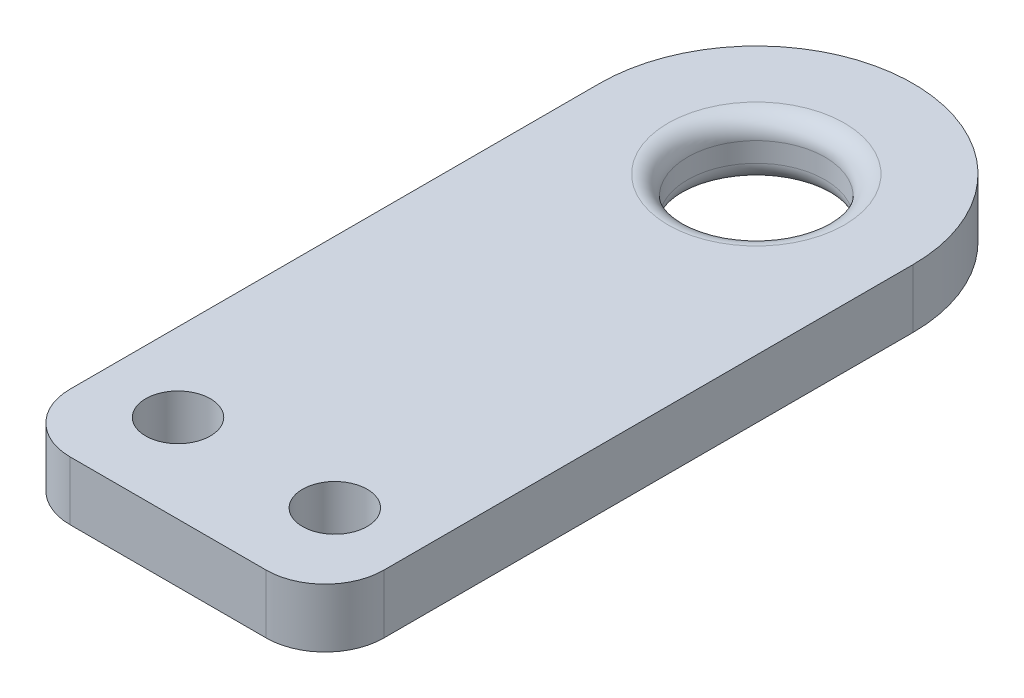
ISO-10303-21;
HEADER;
FILE_DESCRIPTION(('STEP AP214'),'2;1');
FILE_NAME('part.step','',(''),(''),'','','');
FILE_SCHEMA(('AUTOMOTIVE_DESIGN { 1 0 10303 214 1 1 1 1 }'));
ENDSEC;
DATA;
#1=APPLICATION_CONTEXT('core data for automotive mechanical design processes');
#2=APPLICATION_PROTOCOL_DEFINITION('international standard','automotive_design',2000,#1);
#3=PRODUCT_CONTEXT('',#1,'mechanical');
#4=PRODUCT('Part','Part','',(#3));
#5=PRODUCT_RELATED_PRODUCT_CATEGORY('part','',(#4));
#6=PRODUCT_DEFINITION_FORMATION('','',#4);
#7=PRODUCT_DEFINITION_CONTEXT('part definition',#1,'design');
#8=PRODUCT_DEFINITION('design','',#6,#7);
#9=PRODUCT_DEFINITION_SHAPE('','',#8);
#10=(LENGTH_UNIT() NAMED_UNIT(*) SI_UNIT(.MILLI.,.METRE.));
#11=(NAMED_UNIT(*) PLANE_ANGLE_UNIT() SI_UNIT($,.RADIAN.));
#12=(NAMED_UNIT(*) SI_UNIT($,.STERADIAN.) SOLID_ANGLE_UNIT());
#13=UNCERTAINTY_MEASURE_WITH_UNIT(LENGTH_MEASURE(1.E-05),#10,'distance_accuracy_value','');
#14=(GEOMETRIC_REPRESENTATION_CONTEXT(3) GLOBAL_UNCERTAINTY_ASSIGNED_CONTEXT((#13)) GLOBAL_UNIT_ASSIGNED_CONTEXT((#10,
#11,#12)) REPRESENTATION_CONTEXT('',''));
#15=CARTESIAN_POINT('',(0.,0.,0.));
#16=DIRECTION('',(0.,0.,1.));
#17=DIRECTION('',(1.,0.,0.));
#18=AXIS2_PLACEMENT_3D('',#15,#16,#17);
#19=CARTESIAN_POINT('',(0.,1.5,0.));
#20=DIRECTION('',(0.,-1.,0.));
#21=DIRECTION('',(0.,0.,-1.));
#22=AXIS2_PLACEMENT_3D('',#19,#20,#21);
#23=CYLINDRICAL_SURFACE('',#22,8.);
#24=DIRECTION('',(0.,-1.,0.));
#25=VECTOR('',#24,1.);
#26=CARTESIAN_POINT('',(-8.,1.5,0.));
#27=LINE('',#26,#25);
#28=CARTESIAN_POINT('',(-8.,1.5,0.));
#29=VERTEX_POINT('',#28);
#30=CARTESIAN_POINT('',(-8.,-1.5,0.));
#31=VERTEX_POINT('',#30);
#32=EDGE_CURVE('E118',#29,#31,#27,.T.);
#33=ORIENTED_EDGE('',*,*,#32,.F.);
#34=CARTESIAN_POINT('',(0.,1.5,0.));
#35=DIRECTION('',(0.,1.,0.));
#36=DIRECTION('',(0.,0.,1.));
#37=AXIS2_PLACEMENT_3D('',#34,#35,#36);
#38=CIRCLE('',#37,8.);
#39=CARTESIAN_POINT('',(8.,1.5,0.));
#40=VERTEX_POINT('',#39);
#41=EDGE_CURVE('E114',#40,#29,#38,.T.);
#42=ORIENTED_EDGE('',*,*,#41,.F.);
#43=DIRECTION('',(0.,-1.,0.));
#44=VECTOR('',#43,1.);
#45=CARTESIAN_POINT('',(8.,1.5,0.));
#46=LINE('',#45,#44);
#47=CARTESIAN_POINT('',(8.,-1.5,0.));
#48=VERTEX_POINT('',#47);
#49=EDGE_CURVE('E101',#40,#48,#46,.T.);
#50=ORIENTED_EDGE('',*,*,#49,.T.);
#51=CARTESIAN_POINT('',(0.,-1.5,0.));
#52=DIRECTION('',(0.,1.,0.));
#53=DIRECTION('',(0.,0.,1.));
#54=AXIS2_PLACEMENT_3D('',#51,#52,#53);
#55=CIRCLE('',#54,8.);
#56=EDGE_CURVE('E108',#48,#31,#55,.T.);
#57=ORIENTED_EDGE('',*,*,#56,.T.);
#58=EDGE_LOOP('',(#33,#42,#50,#57));
#59=FACE_BOUND('',#58,.T.);
#60=ADVANCED_FACE('F41',(#59),#23,.T.);
#61=CARTESIAN_POINT('',(0.,1.5,0.));
#62=DIRECTION('',(0.,1.,0.));
#63=DIRECTION('',(0.,0.,1.));
#64=AXIS2_PLACEMENT_3D('',#61,#62,#63);
#65=PLANE('',#64);
#66=CARTESIAN_POINT('',(0.,1.5,0.));
#67=DIRECTION('',(0.,1.,0.));
#68=DIRECTION('',(0.,0.,1.));
#69=AXIS2_PLACEMENT_3D('',#66,#67,#68);
#70=CIRCLE('',#69,4.5);
#71=CARTESIAN_POINT('',(0.,1.5,4.5));
#72=VERTEX_POINT('',#71);
#73=EDGE_CURVE('E124',#72,#72,#70,.F.);
#74=ORIENTED_EDGE('',*,*,#73,.T.);
#75=EDGE_LOOP('',(#74));
#76=FACE_BOUND('',#75,.T.);
#77=CARTESIAN_POINT('',(4.,1.5,25.5));
#78=DIRECTION('',(0.,1.,0.));
#79=DIRECTION('',(0.,0.,1.));
#80=AXIS2_PLACEMENT_3D('',#77,#78,#79);
#81=CIRCLE('',#80,1.65);
#82=CARTESIAN_POINT('',(4.,1.5,27.15));
#83=VERTEX_POINT('',#82);
#84=EDGE_CURVE('E163',#83,#83,#81,.T.);
#85=ORIENTED_EDGE('',*,*,#84,.F.);
#86=EDGE_LOOP('',(#85));
#87=FACE_BOUND('',#86,.T.);
#88=CARTESIAN_POINT('',(-4.,1.5,25.5));
#89=DIRECTION('',(0.,1.,0.));
#90=DIRECTION('',(0.,0.,1.));
#91=AXIS2_PLACEMENT_3D('',#88,#89,#90);
#92=CIRCLE('',#91,1.65);
#93=CARTESIAN_POINT('',(-4.,1.5,27.15));
#94=VERTEX_POINT('',#93);
#95=EDGE_CURVE('E168',#94,#94,#92,.T.);
#96=ORIENTED_EDGE('',*,*,#95,.F.);
#97=EDGE_LOOP('',(#96));
#98=FACE_BOUND('',#97,.T.);
#99=DIRECTION('',(0.,0.,1.));
#100=VECTOR('',#99,1.);
#101=CARTESIAN_POINT('',(-8.,1.5,0.));
#102=LINE('',#101,#100);
#103=CARTESIAN_POINT('',(-8.,1.5,27.));
#104=VERTEX_POINT('',#103);
#105=EDGE_CURVE('E104',#29,#104,#102,.T.);
#106=ORIENTED_EDGE('',*,*,#105,.T.);
#107=CARTESIAN_POINT('',(-5.,1.5,27.));
#108=DIRECTION('',(0.,1.,0.));
#109=DIRECTION('',(0.,0.,1.));
#110=AXIS2_PLACEMENT_3D('',#107,#108,#109);
#111=CIRCLE('',#110,3.);
#112=CARTESIAN_POINT('',(-5.,1.5,30.));
#113=VERTEX_POINT('',#112);
#114=EDGE_CURVE('E49',#104,#113,#111,.T.);
#115=ORIENTED_EDGE('',*,*,#114,.T.);
#116=DIRECTION('',(1.,0.,0.));
#117=VECTOR('',#116,1.);
#118=CARTESIAN_POINT('',(-8.,1.5,30.));
#119=LINE('',#118,#117);
#120=CARTESIAN_POINT('',(5.,1.5,30.));
#121=VERTEX_POINT('',#120);
#122=EDGE_CURVE('E149',#113,#121,#119,.T.);
#123=ORIENTED_EDGE('',*,*,#122,.T.);
#124=CARTESIAN_POINT('',(5.,1.5,27.));
#125=DIRECTION('',(0.,1.,0.));
#126=DIRECTION('',(0.,0.,1.));
#127=AXIS2_PLACEMENT_3D('',#124,#125,#126);
#128=CIRCLE('',#127,3.);
#129=CARTESIAN_POINT('',(8.,1.5,27.));
#130=VERTEX_POINT('',#129);
#131=EDGE_CURVE('E56',#121,#130,#128,.T.);
#132=ORIENTED_EDGE('',*,*,#131,.T.);
#133=DIRECTION('',(0.,0.,-1.));
#134=VECTOR('',#133,1.);
#135=CARTESIAN_POINT('',(8.,1.5,0.));
#136=LINE('',#135,#134);
#137=EDGE_CURVE('E120',#130,#40,#136,.T.);
#138=ORIENTED_EDGE('',*,*,#137,.T.);
#139=ORIENTED_EDGE('',*,*,#41,.T.);
#140=EDGE_LOOP('',(#106,#115,#123,#132,#138,#139));
#141=FACE_BOUND('',#140,.T.);
#142=ADVANCED_FACE('F148',(#76,#87,#98,#141),#65,.T.);
#143=CARTESIAN_POINT('',(0.,-1.5,0.));
#144=DIRECTION('',(0.,1.,0.));
#145=DIRECTION('',(0.,0.,1.));
#146=AXIS2_PLACEMENT_3D('',#143,#144,#145);
#147=PLANE('',#146);
#148=CARTESIAN_POINT('',(0.,-1.5,0.));
#149=DIRECTION('',(0.,1.,0.));
#150=DIRECTION('',(0.,0.,1.));
#151=AXIS2_PLACEMENT_3D('',#148,#149,#150);
#152=CIRCLE('',#151,4.5);
#153=CARTESIAN_POINT('',(0.,-1.5,4.5));
#154=VERTEX_POINT('',#153);
#155=EDGE_CURVE('E133',#154,#154,#152,.T.);
#156=ORIENTED_EDGE('',*,*,#155,.T.);
#157=EDGE_LOOP('',(#156));
#158=FACE_BOUND('',#157,.T.);
#159=CARTESIAN_POINT('',(4.,-1.5,25.5));
#160=DIRECTION('',(0.,1.,0.));
#161=DIRECTION('',(0.,0.,1.));
#162=AXIS2_PLACEMENT_3D('',#159,#160,#161);
#163=CIRCLE('',#162,1.65);
#164=CARTESIAN_POINT('',(4.,-1.5,27.15));
#165=VERTEX_POINT('',#164);
#166=EDGE_CURVE('E159',#165,#165,#163,.F.);
#167=ORIENTED_EDGE('',*,*,#166,.F.);
#168=EDGE_LOOP('',(#167));
#169=FACE_BOUND('',#168,.T.);
#170=CARTESIAN_POINT('',(-4.,-1.5,25.5));
#171=DIRECTION('',(0.,1.,0.));
#172=DIRECTION('',(0.,0.,1.));
#173=AXIS2_PLACEMENT_3D('',#170,#171,#172);
#174=CIRCLE('',#173,1.65);
#175=CARTESIAN_POINT('',(-4.,-1.5,27.15));
#176=VERTEX_POINT('',#175);
#177=EDGE_CURVE('E171',#176,#176,#174,.F.);
#178=ORIENTED_EDGE('',*,*,#177,.F.);
#179=EDGE_LOOP('',(#178));
#180=FACE_BOUND('',#179,.T.);
#181=DIRECTION('',(1.,0.,0.));
#182=VECTOR('',#181,1.);
#183=CARTESIAN_POINT('',(-8.,-1.5,30.));
#184=LINE('',#183,#182);
#185=CARTESIAN_POINT('',(-5.,-1.5,30.));
#186=VERTEX_POINT('',#185);
#187=CARTESIAN_POINT('',(5.,-1.5,30.));
#188=VERTEX_POINT('',#187);
#189=EDGE_CURVE('E105',#186,#188,#184,.T.);
#190=ORIENTED_EDGE('',*,*,#189,.F.);
#191=CARTESIAN_POINT('',(-5.,-1.5,27.));
#192=DIRECTION('',(0.,1.,0.));
#193=DIRECTION('',(0.,0.,1.));
#194=AXIS2_PLACEMENT_3D('',#191,#192,#193);
#195=CIRCLE('',#194,3.);
#196=CARTESIAN_POINT('',(-8.,-1.5,27.));
#197=VERTEX_POINT('',#196);
#198=EDGE_CURVE('E143',#186,#197,#195,.F.);
#199=ORIENTED_EDGE('',*,*,#198,.T.);
#200=DIRECTION('',(0.,0.,1.));
#201=VECTOR('',#200,1.);
#202=CARTESIAN_POINT('',(-8.,-1.5,0.));
#203=LINE('',#202,#201);
#204=EDGE_CURVE('E111',#31,#197,#203,.T.);
#205=ORIENTED_EDGE('',*,*,#204,.F.);
#206=ORIENTED_EDGE('',*,*,#56,.F.);
#207=DIRECTION('',(0.,0.,-1.));
#208=VECTOR('',#207,1.);
#209=CARTESIAN_POINT('',(8.,-1.5,0.));
#210=LINE('',#209,#208);
#211=CARTESIAN_POINT('',(8.,-1.5,27.));
#212=VERTEX_POINT('',#211);
#213=EDGE_CURVE('E97',#212,#48,#210,.T.);
#214=ORIENTED_EDGE('',*,*,#213,.F.);
#215=CARTESIAN_POINT('',(5.,-1.5,27.));
#216=DIRECTION('',(0.,1.,0.));
#217=DIRECTION('',(0.,0.,1.));
#218=AXIS2_PLACEMENT_3D('',#215,#216,#217);
#219=CIRCLE('',#218,3.);
#220=EDGE_CURVE('E141',#212,#188,#219,.F.);
#221=ORIENTED_EDGE('',*,*,#220,.T.);
#222=EDGE_LOOP('',(#190,#199,#205,#206,#214,#221));
#223=FACE_BOUND('',#222,.T.);
#224=ADVANCED_FACE('F110',(#158,#169,#180,#223),#147,.F.);
#225=CARTESIAN_POINT('',(-8.,1.5,0.));
#226=DIRECTION('',(1.,0.,0.));
#227=DIRECTION('',(0.,0.,-1.));
#228=AXIS2_PLACEMENT_3D('',#225,#226,#227);
#229=PLANE('',#228);
#230=ORIENTED_EDGE('',*,*,#204,.T.);
#231=DIRECTION('',(0.,-1.,0.));
#232=VECTOR('',#231,1.);
#233=CARTESIAN_POINT('',(-8.,1.5,27.));
#234=LINE('',#233,#232);
#235=EDGE_CURVE('E64',#197,#104,#234,.F.);
#236=ORIENTED_EDGE('',*,*,#235,.T.);
#237=ORIENTED_EDGE('',*,*,#105,.F.);
#238=ORIENTED_EDGE('',*,*,#32,.T.);
#239=EDGE_LOOP('',(#230,#236,#237,#238));
#240=FACE_BOUND('',#239,.T.);
#241=ADVANCED_FACE('F158',(#240),#229,.F.);
#242=CARTESIAN_POINT('',(-8.,1.5,30.));
#243=DIRECTION('',(0.,0.,-1.));
#244=DIRECTION('',(-1.,0.,0.));
#245=AXIS2_PLACEMENT_3D('',#242,#243,#244);
#246=PLANE('',#245);
#247=ORIENTED_EDGE('',*,*,#122,.F.);
#248=DIRECTION('',(0.,-1.,0.));
#249=VECTOR('',#248,1.);
#250=CARTESIAN_POINT('',(-5.,1.5,30.));
#251=LINE('',#250,#249);
#252=EDGE_CURVE('E138',#113,#186,#251,.T.);
#253=ORIENTED_EDGE('',*,*,#252,.T.);
#254=ORIENTED_EDGE('',*,*,#189,.T.);
#255=DIRECTION('',(0.,-1.,0.));
#256=VECTOR('',#255,1.);
#257=CARTESIAN_POINT('',(5.,1.5,30.));
#258=LINE('',#257,#256);
#259=EDGE_CURVE('E136',#188,#121,#258,.F.);
#260=ORIENTED_EDGE('',*,*,#259,.T.);
#261=EDGE_LOOP('',(#247,#253,#254,#260));
#262=FACE_BOUND('',#261,.T.);
#263=ADVANCED_FACE('F153',(#262),#246,.F.);
#264=CARTESIAN_POINT('',(8.,1.5,0.));
#265=DIRECTION('',(-1.,0.,0.));
#266=DIRECTION('',(0.,0.,1.));
#267=AXIS2_PLACEMENT_3D('',#264,#265,#266);
#268=PLANE('',#267);
#269=ORIENTED_EDGE('',*,*,#137,.F.);
#270=DIRECTION('',(0.,-1.,0.));
#271=VECTOR('',#270,1.);
#272=CARTESIAN_POINT('',(8.,1.5,27.));
#273=LINE('',#272,#271);
#274=EDGE_CURVE('E11',#130,#212,#273,.T.);
#275=ORIENTED_EDGE('',*,*,#274,.T.);
#276=ORIENTED_EDGE('',*,*,#213,.T.);
#277=ORIENTED_EDGE('',*,*,#49,.F.);
#278=EDGE_LOOP('',(#269,#275,#276,#277));
#279=FACE_BOUND('',#278,.T.);
#280=ADVANCED_FACE('F99',(#279),#268,.F.);
#281=CARTESIAN_POINT('',(-4.,-1.501,25.5));
#282=DIRECTION('',(0.,1.,0.));
#283=DIRECTION('',(0.,0.,1.));
#284=AXIS2_PLACEMENT_3D('',#281,#282,#283);
#285=CYLINDRICAL_SURFACE('',#284,1.65);
#286=CARTESIAN_POINT('',(-4.,1.5,27.15));
#287=CARTESIAN_POINT('',(-4.,1.46875,27.15));
#288=CARTESIAN_POINT('',(-4.,1.4375,27.15));
#289=CARTESIAN_POINT('',(-4.,1.375,27.15));
#290=CARTESIAN_POINT('',(-4.,1.34375,27.15));
#291=CARTESIAN_POINT('',(-4.,1.28125,27.15));
#292=CARTESIAN_POINT('',(-4.,1.25,27.15));
#293=CARTESIAN_POINT('',(-4.,1.1875,27.15));
#294=CARTESIAN_POINT('',(-4.,1.15625,27.15));
#295=CARTESIAN_POINT('',(-4.,1.09375,27.15));
#296=CARTESIAN_POINT('',(-4.,1.0625,27.15));
#297=CARTESIAN_POINT('',(-4.,1.,27.15));
#298=CARTESIAN_POINT('',(-4.,0.96875,27.15));
#299=CARTESIAN_POINT('',(-4.,0.90625,27.15));
#300=CARTESIAN_POINT('',(-4.,0.874999999999999,27.15));
#301=CARTESIAN_POINT('',(-4.,0.8125,27.15));
#302=CARTESIAN_POINT('',(-4.,0.78125,27.15));
#303=CARTESIAN_POINT('',(-4.,0.71875,27.15));
#304=CARTESIAN_POINT('',(-4.,0.6875,27.15));
#305=CARTESIAN_POINT('',(-4.,0.625,27.15));
#306=CARTESIAN_POINT('',(-4.,0.59375,27.15));
#307=CARTESIAN_POINT('',(-4.,0.53125,27.15));
#308=CARTESIAN_POINT('',(-4.,0.5,27.15));
#309=CARTESIAN_POINT('',(-4.,0.4375,27.15));
#310=CARTESIAN_POINT('',(-4.,0.40625,27.15));
#311=CARTESIAN_POINT('',(-4.,0.34375,27.15));
#312=CARTESIAN_POINT('',(-4.,0.3125,27.15));
#313=CARTESIAN_POINT('',(-4.,0.25,27.15));
#314=CARTESIAN_POINT('',(-4.,0.21875,27.15));
#315=CARTESIAN_POINT('',(-4.,0.15625,27.15));
#316=CARTESIAN_POINT('',(-4.,0.125,27.15));
#317=CARTESIAN_POINT('',(-4.,0.0624999999999998,27.15));
#318=CARTESIAN_POINT('',(-4.,0.0312499999999998,27.15));
#319=CARTESIAN_POINT('',(-4.,-0.0312500000000002,27.15));
#320=CARTESIAN_POINT('',(-4.,-0.0625000000000003,27.15));
#321=CARTESIAN_POINT('',(-4.,-0.125,27.15));
#322=CARTESIAN_POINT('',(-4.,-0.15625,27.15));
#323=CARTESIAN_POINT('',(-4.,-0.21875,27.15));
#324=CARTESIAN_POINT('',(-4.,-0.25,27.15));
#325=CARTESIAN_POINT('',(-4.,-0.3125,27.15));
#326=CARTESIAN_POINT('',(-4.,-0.34375,27.15));
#327=CARTESIAN_POINT('',(-4.,-0.40625,27.15));
#328=CARTESIAN_POINT('',(-4.,-0.4375,27.15));
#329=CARTESIAN_POINT('',(-4.,-0.5,27.15));
#330=CARTESIAN_POINT('',(-4.,-0.53125,27.15));
#331=CARTESIAN_POINT('',(-4.,-0.59375,27.15));
#332=CARTESIAN_POINT('',(-4.,-0.625,27.15));
#333=CARTESIAN_POINT('',(-4.,-0.6875,27.15));
#334=CARTESIAN_POINT('',(-4.,-0.71875,27.15));
#335=CARTESIAN_POINT('',(-4.,-0.78125,27.15));
#336=CARTESIAN_POINT('',(-4.,-0.8125,27.15));
#337=CARTESIAN_POINT('',(-4.,-0.875,27.15));
#338=CARTESIAN_POINT('',(-4.,-0.90625,27.15));
#339=CARTESIAN_POINT('',(-4.,-0.96875,27.15));
#340=CARTESIAN_POINT('',(-4.,-1.,27.15));
#341=CARTESIAN_POINT('',(-4.,-1.0625,27.15));
#342=CARTESIAN_POINT('',(-4.,-1.09375,27.15));
#343=CARTESIAN_POINT('',(-4.,-1.15625,27.15));
#344=CARTESIAN_POINT('',(-4.,-1.1875,27.15));
#345=CARTESIAN_POINT('',(-4.,-1.25,27.15));
#346=CARTESIAN_POINT('',(-4.,-1.28125,27.15));
#347=CARTESIAN_POINT('',(-4.,-1.34375,27.15));
#348=CARTESIAN_POINT('',(-4.,-1.375,27.15));
#349=CARTESIAN_POINT('',(-4.,-1.4375,27.15));
#350=CARTESIAN_POINT('',(-4.,-1.46875,27.15));
#351=CARTESIAN_POINT('',(-4.,-1.5,27.15));
#352=B_SPLINE_CURVE_WITH_KNOTS('',3,(#286,#287,#288,#289,#290,#291,#292,#293,#294,#295,#296,
#297,#298,#299,#300,#301,#302,#303,#304,#305,#306,#307,#308,#309,#310,#311,#312,#313,#314,#315,
#316,#317,#318,#319,#320,#321,#322,#323,#324,#325,#326,#327,#328,#329,#330,#331,#332,#333,#334,
#335,#336,#337,#338,#339,#340,#341,#342,#343,#344,#345,#346,#347,#348,#349,#350,#351),
.UNSPECIFIED.,.F.,.F.,(4,2,2,2,2,2,2,2,2,2,2,2,2,2,2,2,2,2,2,2,2,2,2,2,2,2,2,2,2,2,2,2,4),(0.,
0.0937500000000001,0.1875,0.28125,0.375,0.46875,0.5625,0.65625,0.75,0.84375,0.9375,1.03125,
1.125,1.21875,1.3125,1.40625,1.5,1.59375,1.6875,1.78125,1.875,1.96875,2.0625,2.15625,2.25,
2.34375,2.4375,2.53125,2.625,2.71875,2.8125,2.90625,3.),.UNSPECIFIED.);
#353=EDGE_CURVE('BSEAM186',#94,#176,#352,.T.);
#354=ORIENTED_EDGE('',*,*,#95,.T.);
#355=ORIENTED_EDGE('',*,*,#177,.T.);
#356=ORIENTED_EDGE('',*,*,#353,.T.);
#357=ORIENTED_EDGE('',*,*,#353,.F.);
#358=EDGE_LOOP('',(#354,#356,#355,#357));
#359=FACE_BOUND('',#358,.T.);
#360=ADVANCED_FACE('F186',(#359),#285,.F.);
#361=CARTESIAN_POINT('',(4.,-1.501,25.5));
#362=DIRECTION('',(0.,1.,0.));
#363=DIRECTION('',(0.,0.,1.));
#364=AXIS2_PLACEMENT_3D('',#361,#362,#363);
#365=CYLINDRICAL_SURFACE('',#364,1.65);
#366=CARTESIAN_POINT('',(4.,1.5,27.15));
#367=CARTESIAN_POINT('',(4.,1.46875,27.15));
#368=CARTESIAN_POINT('',(4.,1.4375,27.15));
#369=CARTESIAN_POINT('',(4.,1.375,27.15));
#370=CARTESIAN_POINT('',(4.,1.34375,27.15));
#371=CARTESIAN_POINT('',(4.,1.28125,27.15));
#372=CARTESIAN_POINT('',(4.,1.25,27.15));
#373=CARTESIAN_POINT('',(4.,1.1875,27.15));
#374=CARTESIAN_POINT('',(4.,1.15625,27.15));
#375=CARTESIAN_POINT('',(4.,1.09375,27.15));
#376=CARTESIAN_POINT('',(4.,1.0625,27.15));
#377=CARTESIAN_POINT('',(4.,1.,27.15));
#378=CARTESIAN_POINT('',(4.,0.96875,27.15));
#379=CARTESIAN_POINT('',(4.,0.90625,27.15));
#380=CARTESIAN_POINT('',(4.,0.874999999999999,27.15));
#381=CARTESIAN_POINT('',(4.,0.8125,27.15));
#382=CARTESIAN_POINT('',(4.,0.78125,27.15));
#383=CARTESIAN_POINT('',(4.,0.71875,27.15));
#384=CARTESIAN_POINT('',(4.,0.6875,27.15));
#385=CARTESIAN_POINT('',(4.,0.625,27.15));
#386=CARTESIAN_POINT('',(4.,0.59375,27.15));
#387=CARTESIAN_POINT('',(4.,0.53125,27.15));
#388=CARTESIAN_POINT('',(4.,0.5,27.15));
#389=CARTESIAN_POINT('',(4.,0.4375,27.15));
#390=CARTESIAN_POINT('',(4.,0.40625,27.15));
#391=CARTESIAN_POINT('',(4.,0.34375,27.15));
#392=CARTESIAN_POINT('',(4.,0.3125,27.15));
#393=CARTESIAN_POINT('',(4.,0.25,27.15));
#394=CARTESIAN_POINT('',(4.,0.21875,27.15));
#395=CARTESIAN_POINT('',(4.,0.15625,27.15));
#396=CARTESIAN_POINT('',(4.,0.125,27.15));
#397=CARTESIAN_POINT('',(4.,0.0624999999999998,27.15));
#398=CARTESIAN_POINT('',(4.,0.0312499999999998,27.15));
#399=CARTESIAN_POINT('',(4.,-0.0312500000000002,27.15));
#400=CARTESIAN_POINT('',(4.,-0.0625000000000003,27.15));
#401=CARTESIAN_POINT('',(4.,-0.125,27.15));
#402=CARTESIAN_POINT('',(4.,-0.15625,27.15));
#403=CARTESIAN_POINT('',(4.,-0.21875,27.15));
#404=CARTESIAN_POINT('',(4.,-0.25,27.15));
#405=CARTESIAN_POINT('',(4.,-0.3125,27.15));
#406=CARTESIAN_POINT('',(4.,-0.34375,27.15));
#407=CARTESIAN_POINT('',(4.,-0.40625,27.15));
#408=CARTESIAN_POINT('',(4.,-0.4375,27.15));
#409=CARTESIAN_POINT('',(4.,-0.5,27.15));
#410=CARTESIAN_POINT('',(4.,-0.53125,27.15));
#411=CARTESIAN_POINT('',(4.,-0.59375,27.15));
#412=CARTESIAN_POINT('',(4.,-0.625,27.15));
#413=CARTESIAN_POINT('',(4.,-0.6875,27.15));
#414=CARTESIAN_POINT('',(4.,-0.71875,27.15));
#415=CARTESIAN_POINT('',(4.,-0.78125,27.15));
#416=CARTESIAN_POINT('',(4.,-0.8125,27.15));
#417=CARTESIAN_POINT('',(4.,-0.875,27.15));
#418=CARTESIAN_POINT('',(4.,-0.90625,27.15));
#419=CARTESIAN_POINT('',(4.,-0.96875,27.15));
#420=CARTESIAN_POINT('',(4.,-1.,27.15));
#421=CARTESIAN_POINT('',(4.,-1.0625,27.15));
#422=CARTESIAN_POINT('',(4.,-1.09375,27.15));
#423=CARTESIAN_POINT('',(4.,-1.15625,27.15));
#424=CARTESIAN_POINT('',(4.,-1.1875,27.15));
#425=CARTESIAN_POINT('',(4.,-1.25,27.15));
#426=CARTESIAN_POINT('',(4.,-1.28125,27.15));
#427=CARTESIAN_POINT('',(4.,-1.34375,27.15));
#428=CARTESIAN_POINT('',(4.,-1.375,27.15));
#429=CARTESIAN_POINT('',(4.,-1.4375,27.15));
#430=CARTESIAN_POINT('',(4.,-1.46875,27.15));
#431=CARTESIAN_POINT('',(4.,-1.5,27.15));
#432=B_SPLINE_CURVE_WITH_KNOTS('',3,(#366,#367,#368,#369,#370,#371,#372,#373,#374,#375,#376,
#377,#378,#379,#380,#381,#382,#383,#384,#385,#386,#387,#388,#389,#390,#391,#392,#393,#394,#395,
#396,#397,#398,#399,#400,#401,#402,#403,#404,#405,#406,#407,#408,#409,#410,#411,#412,#413,#414,
#415,#416,#417,#418,#419,#420,#421,#422,#423,#424,#425,#426,#427,#428,#429,#430,#431),
.UNSPECIFIED.,.F.,.F.,(4,2,2,2,2,2,2,2,2,2,2,2,2,2,2,2,2,2,2,2,2,2,2,2,2,2,2,2,2,2,2,2,4),(0.,
0.0937500000000001,0.1875,0.28125,0.375,0.46875,0.5625,0.65625,0.75,0.84375,0.9375,1.03125,
1.125,1.21875,1.3125,1.40625,1.5,1.59375,1.6875,1.78125,1.875,1.96875,2.0625,2.15625,2.25,
2.34375,2.4375,2.53125,2.625,2.71875,2.8125,2.90625,3.),.UNSPECIFIED.);
#433=EDGE_CURVE('BSEAM177',#83,#165,#432,.T.);
#434=ORIENTED_EDGE('',*,*,#84,.T.);
#435=ORIENTED_EDGE('',*,*,#166,.T.);
#436=ORIENTED_EDGE('',*,*,#433,.T.);
#437=ORIENTED_EDGE('',*,*,#433,.F.);
#438=EDGE_LOOP('',(#434,#436,#435,#437));
#439=FACE_BOUND('',#438,.T.);
#440=ADVANCED_FACE('F177',(#439),#365,.F.);
#441=CARTESIAN_POINT('',(0.,1.501,0.));
#442=DIRECTION('',(0.,-1.,0.));
#443=DIRECTION('',(0.,0.,-1.));
#444=AXIS2_PLACEMENT_3D('',#441,#442,#443);
#445=CYLINDRICAL_SURFACE('',#444,3.5);
#446=CARTESIAN_POINT('',(0.,0.5,0.));
#447=DIRECTION('',(0.,1.,0.));
#448=DIRECTION('',(0.,0.,1.));
#449=AXIS2_PLACEMENT_3D('',#446,#447,#448);
#450=CIRCLE('',#449,3.5);
#451=CARTESIAN_POINT('',(0.,0.5,-3.5));
#452=VERTEX_POINT('',#451);
#453=EDGE_CURVE('E130',#452,#452,#450,.T.);
#454=CARTESIAN_POINT('',(0.,-0.5,0.));
#455=DIRECTION('',(0.,1.,0.));
#456=DIRECTION('',(0.,0.,1.));
#457=AXIS2_PLACEMENT_3D('',#454,#455,#456);
#458=CIRCLE('',#457,3.5);
#459=CARTESIAN_POINT('',(0.,-0.5,-3.5));
#460=VERTEX_POINT('',#459);
#461=EDGE_CURVE('E127',#460,#460,#458,.F.);
#462=CARTESIAN_POINT('',(0.,0.5,-3.5));
#463=CARTESIAN_POINT('',(0.,0.489583333333333,-3.5));
#464=CARTESIAN_POINT('',(0.,0.479166666666666,-3.5));
#465=CARTESIAN_POINT('',(0.,0.458333333333333,-3.5));
#466=CARTESIAN_POINT('',(0.,0.447916666666666,-3.5));
#467=CARTESIAN_POINT('',(0.,0.427083333333333,-3.5));
#468=CARTESIAN_POINT('',(0.,0.416666666666666,-3.5));
#469=CARTESIAN_POINT('',(0.,0.395833333333333,-3.5));
#470=CARTESIAN_POINT('',(0.,0.385416666666666,-3.5));
#471=CARTESIAN_POINT('',(0.,0.364583333333333,-3.5));
#472=CARTESIAN_POINT('',(0.,0.354166666666666,-3.5));
#473=CARTESIAN_POINT('',(0.,0.333333333333333,-3.5));
#474=CARTESIAN_POINT('',(0.,0.322916666666666,-3.5));
#475=CARTESIAN_POINT('',(0.,0.302083333333333,-3.5));
#476=CARTESIAN_POINT('',(0.,0.291666666666666,-3.5));
#477=CARTESIAN_POINT('',(0.,0.270833333333333,-3.5));
#478=CARTESIAN_POINT('',(0.,0.260416666666666,-3.5));
#479=CARTESIAN_POINT('',(0.,0.239583333333333,-3.5));
#480=CARTESIAN_POINT('',(0.,0.229166666666666,-3.5));
#481=CARTESIAN_POINT('',(0.,0.208333333333333,-3.5));
#482=CARTESIAN_POINT('',(0.,0.197916666666666,-3.5));
#483=CARTESIAN_POINT('',(0.,0.177083333333333,-3.5));
#484=CARTESIAN_POINT('',(0.,0.166666666666666,-3.5));
#485=CARTESIAN_POINT('',(0.,0.145833333333333,-3.5));
#486=CARTESIAN_POINT('',(0.,0.135416666666666,-3.5));
#487=CARTESIAN_POINT('',(0.,0.114583333333333,-3.5));
#488=CARTESIAN_POINT('',(0.,0.104166666666666,-3.5));
#489=CARTESIAN_POINT('',(0.,0.083333333333333,-3.5));
#490=CARTESIAN_POINT('',(0.,0.0729166666666663,-3.5));
#491=CARTESIAN_POINT('',(0.,0.0520833333333329,-3.5));
#492=CARTESIAN_POINT('',(0.,0.0416666666666663,-3.5));
#493=CARTESIAN_POINT('',(0.,0.0208333333333329,-3.5));
#494=CARTESIAN_POINT('',(0.,0.0104166666666662,-3.5));
#495=CARTESIAN_POINT('',(0.,-0.0104166666666671,-3.5));
#496=CARTESIAN_POINT('',(0.,-0.0208333333333338,-3.5));
#497=CARTESIAN_POINT('',(0.,-0.0416666666666671,-3.5));
#498=CARTESIAN_POINT('',(0.,-0.0520833333333338,-3.5));
#499=CARTESIAN_POINT('',(0.,-0.0729166666666672,-3.5));
#500=CARTESIAN_POINT('',(0.,-0.0833333333333338,-3.5));
#501=CARTESIAN_POINT('',(0.,-0.104166666666667,-3.5));
#502=CARTESIAN_POINT('',(0.,-0.114583333333334,-3.5));
#503=CARTESIAN_POINT('',(0.,-0.135416666666667,-3.5));
#504=CARTESIAN_POINT('',(0.,-0.145833333333334,-3.5));
#505=CARTESIAN_POINT('',(0.,-0.166666666666667,-3.5));
#506=CARTESIAN_POINT('',(0.,-0.177083333333334,-3.5));
#507=CARTESIAN_POINT('',(0.,-0.197916666666667,-3.5));
#508=CARTESIAN_POINT('',(0.,-0.208333333333334,-3.5));
#509=CARTESIAN_POINT('',(0.,-0.229166666666667,-3.5));
#510=CARTESIAN_POINT('',(0.,-0.239583333333334,-3.5));
#511=CARTESIAN_POINT('',(0.,-0.260416666666667,-3.5));
#512=CARTESIAN_POINT('',(0.,-0.270833333333334,-3.5));
#513=CARTESIAN_POINT('',(0.,-0.291666666666667,-3.5));
#514=CARTESIAN_POINT('',(0.,-0.302083333333334,-3.5));
#515=CARTESIAN_POINT('',(0.,-0.322916666666667,-3.5));
#516=CARTESIAN_POINT('',(0.,-0.333333333333334,-3.5));
#517=CARTESIAN_POINT('',(0.,-0.354166666666667,-3.5));
#518=CARTESIAN_POINT('',(0.,-0.364583333333334,-3.5));
#519=CARTESIAN_POINT('',(0.,-0.385416666666667,-3.5));
#520=CARTESIAN_POINT('',(0.,-0.395833333333334,-3.5));
#521=CARTESIAN_POINT('',(0.,-0.416666666666667,-3.5));
#522=CARTESIAN_POINT('',(0.,-0.427083333333334,-3.5));
#523=CARTESIAN_POINT('',(0.,-0.447916666666667,-3.5));
#524=CARTESIAN_POINT('',(0.,-0.458333333333334,-3.5));
#525=CARTESIAN_POINT('',(0.,-0.479166666666667,-3.5));
#526=CARTESIAN_POINT('',(0.,-0.489583333333334,-3.5));
#527=CARTESIAN_POINT('',(0.,-0.5,-3.5));
#528=B_SPLINE_CURVE_WITH_KNOTS('',3,(#462,#463,#464,#465,#466,#467,#468,#469,#470,#471,#472,
#473,#474,#475,#476,#477,#478,#479,#480,#481,#482,#483,#484,#485,#486,#487,#488,#489,#490,#491,
#492,#493,#494,#495,#496,#497,#498,#499,#500,#501,#502,#503,#504,#505,#506,#507,#508,#509,#510,
#511,#512,#513,#514,#515,#516,#517,#518,#519,#520,#521,#522,#523,#524,#525,#526,#527),
.UNSPECIFIED.,.F.,.F.,(4,2,2,2,2,2,2,2,2,2,2,2,2,2,2,2,2,2,2,2,2,2,2,2,2,2,2,2,2,2,2,2,4),(0.,
0.03125,0.0625000000000001,0.0937500000000001,0.125,0.15625,0.1875,0.21875,0.25,0.28125,0.3125,
0.34375,0.375,0.40625,0.4375,0.46875,0.5,0.53125,0.5625,0.59375,0.625,0.65625,0.6875,0.71875,
0.75,0.78125,0.8125,0.84375,0.875,0.90625,0.9375,0.96875,1.),.UNSPECIFIED.);
#529=EDGE_CURVE('BSEAM209',#452,#460,#528,.T.);
#530=ORIENTED_EDGE('',*,*,#453,.T.);
#531=ORIENTED_EDGE('',*,*,#461,.T.);
#532=ORIENTED_EDGE('',*,*,#529,.T.);
#533=ORIENTED_EDGE('',*,*,#529,.F.);
#534=EDGE_LOOP('',(#530,#532,#531,#533));
#535=FACE_BOUND('',#534,.T.);
#536=ADVANCED_FACE('F209',(#535),#445,.F.);
#537=CARTESIAN_POINT('',(0.,0.5,0.));
#538=DIRECTION('',(0.,1.,0.));
#539=DIRECTION('',(0.,0.,1.));
#540=AXIS2_PLACEMENT_3D('',#537,#538,#539);
#541=TOROIDAL_SURFACE('',#540,4.5,1.);
#542=ORIENTED_EDGE('',*,*,#453,.F.);
#543=EDGE_LOOP('',(#542));
#544=FACE_BOUND('',#543,.T.);
#545=ORIENTED_EDGE('',*,*,#73,.F.);
#546=EDGE_LOOP('',(#545));
#547=FACE_BOUND('',#546,.T.);
#548=ADVANCED_FACE('F205',(#544,#547),#541,.T.);
#549=CARTESIAN_POINT('',(0.,-0.5,0.));
#550=DIRECTION('',(0.,1.,0.));
#551=DIRECTION('',(0.,0.,1.));
#552=AXIS2_PLACEMENT_3D('',#549,#550,#551);
#553=TOROIDAL_SURFACE('',#552,4.5,1.);
#554=ORIENTED_EDGE('',*,*,#155,.F.);
#555=EDGE_LOOP('',(#554));
#556=FACE_BOUND('',#555,.T.);
#557=ORIENTED_EDGE('',*,*,#461,.F.);
#558=EDGE_LOOP('',(#557));
#559=FACE_BOUND('',#558,.T.);
#560=ADVANCED_FACE('F208',(#556,#559),#553,.T.);
#561=CARTESIAN_POINT('',(-5.,1.5,27.));
#562=DIRECTION('',(0.,-1.,0.));
#563=DIRECTION('',(0.,0.,-1.));
#564=AXIS2_PLACEMENT_3D('',#561,#562,#563);
#565=CYLINDRICAL_SURFACE('',#564,3.);
#566=ORIENTED_EDGE('',*,*,#114,.F.);
#567=ORIENTED_EDGE('',*,*,#235,.F.);
#568=ORIENTED_EDGE('',*,*,#198,.F.);
#569=ORIENTED_EDGE('',*,*,#252,.F.);
#570=EDGE_LOOP('',(#566,#567,#568,#569));
#571=FACE_BOUND('',#570,.T.);
#572=ADVANCED_FACE('F157',(#571),#565,.T.);
#573=CARTESIAN_POINT('',(5.,1.5,27.));
#574=DIRECTION('',(0.,-1.,0.));
#575=DIRECTION('',(0.,0.,-1.));
#576=AXIS2_PLACEMENT_3D('',#573,#574,#575);
#577=CYLINDRICAL_SURFACE('',#576,3.);
#578=ORIENTED_EDGE('',*,*,#131,.F.);
#579=ORIENTED_EDGE('',*,*,#259,.F.);
#580=ORIENTED_EDGE('',*,*,#220,.F.);
#581=ORIENTED_EDGE('',*,*,#274,.F.);
#582=EDGE_LOOP('',(#578,#579,#580,#581));
#583=FACE_BOUND('',#582,.T.);
#584=ADVANCED_FACE('F43',(#583),#577,.T.);
#585=CLOSED_SHELL('',(#60,#142,#224,#241,#263,#280,#360,#440,#536,#548,#560,#572,#584));
#586=MANIFOLD_SOLID_BREP('B2',#585);
#587=ADVANCED_BREP_SHAPE_REPRESENTATION('',(#18,#586),#14);
#588=SHAPE_DEFINITION_REPRESENTATION(#9,#587);
ENDSEC;
END-ISO-10303-21;
